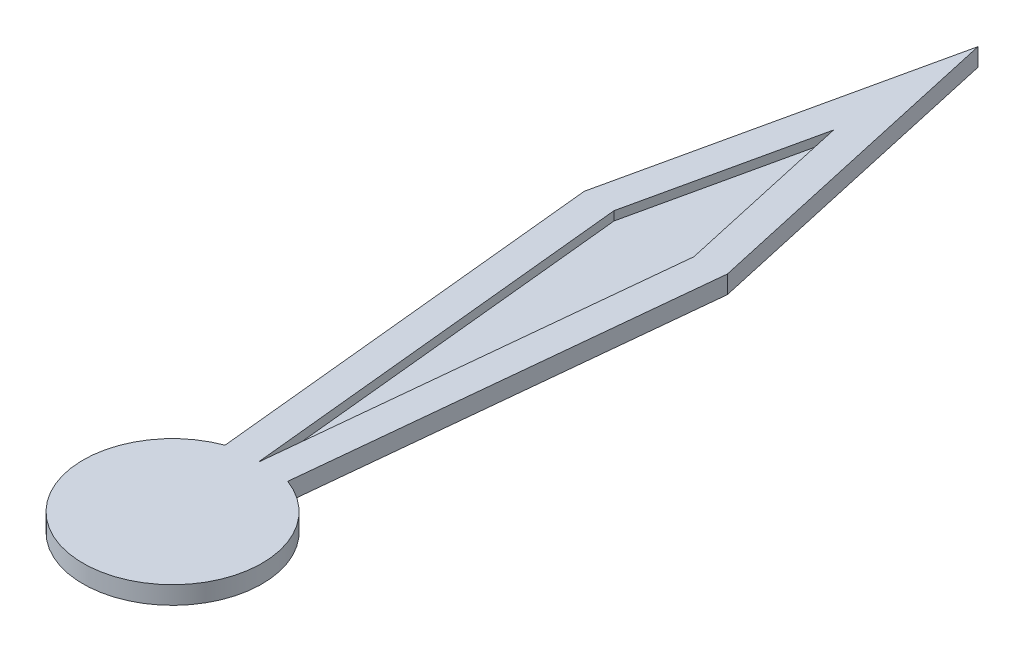
ISO-10303-21;
HEADER;
FILE_DESCRIPTION(('STEP AP214'),'2;1');
FILE_NAME('part.step','',(''),(''),'','','');
FILE_SCHEMA(('AUTOMOTIVE_DESIGN { 1 0 10303 214 1 1 1 1 }'));
ENDSEC;
DATA;
#1=APPLICATION_CONTEXT('core data for automotive mechanical design processes');
#2=APPLICATION_PROTOCOL_DEFINITION('international standard','automotive_design',2000,#1);
#3=PRODUCT_CONTEXT('',#1,'mechanical');
#4=PRODUCT('Part','Part','',(#3));
#5=PRODUCT_RELATED_PRODUCT_CATEGORY('part','',(#4));
#6=PRODUCT_DEFINITION_FORMATION('','',#4);
#7=PRODUCT_DEFINITION_CONTEXT('part definition',#1,'design');
#8=PRODUCT_DEFINITION('design','',#6,#7);
#9=PRODUCT_DEFINITION_SHAPE('','',#8);
#10=(LENGTH_UNIT() NAMED_UNIT(*) SI_UNIT(.MILLI.,.METRE.));
#11=(NAMED_UNIT(*) PLANE_ANGLE_UNIT() SI_UNIT($,.RADIAN.));
#12=(NAMED_UNIT(*) SI_UNIT($,.STERADIAN.) SOLID_ANGLE_UNIT());
#13=UNCERTAINTY_MEASURE_WITH_UNIT(LENGTH_MEASURE(1.E-05),#10,'distance_accuracy_value','');
#14=(GEOMETRIC_REPRESENTATION_CONTEXT(3) GLOBAL_UNCERTAINTY_ASSIGNED_CONTEXT((#13)) GLOBAL_UNIT_ASSIGNED_CONTEXT((#10,
#11,#12)) REPRESENTATION_CONTEXT('',''));
#15=CARTESIAN_POINT('',(0.,0.,0.));
#16=DIRECTION('',(0.,0.,1.));
#17=DIRECTION('',(1.,0.,0.));
#18=AXIS2_PLACEMENT_3D('',#15,#16,#17);
#19=CARTESIAN_POINT('',(0.,0.2,-9.));
#20=DIRECTION('',(0.976187060183953,0.,0.216930457818656));
#21=DIRECTION('',(0.216930457818656,0.,-0.976187060183953));
#22=AXIS2_PLACEMENT_3D('',#19,#20,#21);
#23=PLANE('',#22);
#24=DIRECTION('',(-0.216930457818656,0.,0.976187060183953));
#25=VECTOR('',#24,1.);
#26=CARTESIAN_POINT('',(0.,0.,-9.));
#27=LINE('',#26,#25);
#28=CARTESIAN_POINT('',(0.,0.,-9.));
#29=VERTEX_POINT('',#28);
#30=CARTESIAN_POINT('',(-0.8,0.,-5.4));
#31=VERTEX_POINT('',#30);
#32=EDGE_CURVE('E123',#29,#31,#27,.T.);
#33=ORIENTED_EDGE('',*,*,#32,.T.);
#34=DIRECTION('',(0.,-1.,0.));
#35=VECTOR('',#34,1.);
#36=CARTESIAN_POINT('',(-0.8,0.2,-5.4));
#37=LINE('',#36,#35);
#38=CARTESIAN_POINT('',(-0.8,0.2,-5.4));
#39=VERTEX_POINT('',#38);
#40=EDGE_CURVE('E11',#39,#31,#37,.T.);
#41=ORIENTED_EDGE('',*,*,#40,.F.);
#42=DIRECTION('',(-0.216930457818656,0.,0.976187060183953));
#43=VECTOR('',#42,1.);
#44=CARTESIAN_POINT('',(0.,0.2,-9.));
#45=LINE('',#44,#43);
#46=CARTESIAN_POINT('',(0.,0.2,-9.));
#47=VERTEX_POINT('',#46);
#48=EDGE_CURVE('E134',#47,#39,#45,.T.);
#49=ORIENTED_EDGE('',*,*,#48,.F.);
#50=DIRECTION('',(0.,-1.,0.));
#51=VECTOR('',#50,1.);
#52=CARTESIAN_POINT('',(0.,0.2,-9.));
#53=LINE('',#52,#51);
#54=EDGE_CURVE('E119',#47,#29,#53,.T.);
#55=ORIENTED_EDGE('',*,*,#54,.T.);
#56=EDGE_LOOP('',(#33,#41,#49,#55));
#57=FACE_BOUND('',#56,.T.);
#58=ADVANCED_FACE('F37',(#57),#23,.F.);
#59=CARTESIAN_POINT('',(-0.8,0.2,-5.4));
#60=DIRECTION('',(0.994955747642705,0.,-0.100314805650742));
#61=DIRECTION('',(-0.100314805650742,0.,-0.994955747642705));
#62=AXIS2_PLACEMENT_3D('',#59,#60,#61);
#63=PLANE('',#62);
#64=DIRECTION('',(0.100314805650742,0.,0.994955747642705));
#65=VECTOR('',#64,1.);
#66=CARTESIAN_POINT('',(-0.8,0.,-5.4));
#67=LINE('',#66,#65);
#68=CARTESIAN_POINT('',(-0.35,0.,-0.93674969975976));
#69=VERTEX_POINT('',#68);
#70=EDGE_CURVE('E126',#31,#69,#67,.T.);
#71=ORIENTED_EDGE('',*,*,#70,.T.);
#72=DIRECTION('',(0.,-1.,0.));
#73=VECTOR('',#72,1.);
#74=CARTESIAN_POINT('',(-0.35,0.2,-0.93674969975976));
#75=LINE('',#74,#73);
#76=CARTESIAN_POINT('',(-0.35,0.2,-0.93674969975976));
#77=VERTEX_POINT('',#76);
#78=EDGE_CURVE('E44',#77,#69,#75,.T.);
#79=ORIENTED_EDGE('',*,*,#78,.F.);
#80=DIRECTION('',(0.100314805650742,0.,0.994955747642705));
#81=VECTOR('',#80,1.);
#82=CARTESIAN_POINT('',(-0.8,0.2,-5.4));
#83=LINE('',#82,#81);
#84=EDGE_CURVE('E92',#39,#77,#83,.T.);
#85=ORIENTED_EDGE('',*,*,#84,.F.);
#86=ORIENTED_EDGE('',*,*,#40,.T.);
#87=EDGE_LOOP('',(#71,#79,#85,#86));
#88=FACE_BOUND('',#87,.T.);
#89=ADVANCED_FACE('F237',(#88),#63,.F.);
#90=CARTESIAN_POINT('',(0.,0.2,0.));
#91=DIRECTION('',(0.,-1.,0.));
#92=DIRECTION('',(0.,0.,-1.));
#93=AXIS2_PLACEMENT_3D('',#90,#91,#92);
#94=CYLINDRICAL_SURFACE('',#93,1.);
#95=CARTESIAN_POINT('',(0.,0.,0.));
#96=DIRECTION('',(0.,1.,0.));
#97=DIRECTION('',(0.,0.,1.));
#98=AXIS2_PLACEMENT_3D('',#95,#96,#97);
#99=CIRCLE('',#98,1.);
#100=CARTESIAN_POINT('',(0.35,0.,-0.93674969975976));
#101=VERTEX_POINT('',#100);
#102=EDGE_CURVE('E112',#69,#101,#99,.T.);
#103=ORIENTED_EDGE('',*,*,#102,.T.);
#104=DIRECTION('',(0.,-1.,0.));
#105=VECTOR('',#104,1.);
#106=CARTESIAN_POINT('',(0.35,0.2,-0.93674969975976));
#107=LINE('',#106,#105);
#108=CARTESIAN_POINT('',(0.35,0.2,-0.93674969975976));
#109=VERTEX_POINT('',#108);
#110=EDGE_CURVE('E109',#109,#101,#107,.T.);
#111=ORIENTED_EDGE('',*,*,#110,.F.);
#112=CARTESIAN_POINT('',(0.,0.2,0.));
#113=DIRECTION('',(0.,1.,0.));
#114=DIRECTION('',(0.,0.,1.));
#115=AXIS2_PLACEMENT_3D('',#112,#113,#114);
#116=CIRCLE('',#115,1.);
#117=EDGE_CURVE('E99',#77,#109,#116,.T.);
#118=ORIENTED_EDGE('',*,*,#117,.F.);
#119=ORIENTED_EDGE('',*,*,#78,.T.);
#120=EDGE_LOOP('',(#103,#111,#118,#119));
#121=FACE_BOUND('',#120,.T.);
#122=ADVANCED_FACE('F110',(#121),#94,.T.);
#123=CARTESIAN_POINT('',(0.8,0.2,-5.4));
#124=DIRECTION('',(-0.994955747642705,0.,-0.100314805650742));
#125=DIRECTION('',(-0.100314805650742,0.,0.994955747642705));
#126=AXIS2_PLACEMENT_3D('',#123,#124,#125);
#127=PLANE('',#126);
#128=DIRECTION('',(0.100314805650742,0.,-0.994955747642705));
#129=VECTOR('',#128,1.);
#130=CARTESIAN_POINT('',(0.8,0.,-5.4));
#131=LINE('',#130,#129);
#132=CARTESIAN_POINT('',(0.8,0.,-5.4));
#133=VERTEX_POINT('',#132);
#134=EDGE_CURVE('E131',#101,#133,#131,.T.);
#135=ORIENTED_EDGE('',*,*,#134,.T.);
#136=DIRECTION('',(0.,-1.,0.));
#137=VECTOR('',#136,1.);
#138=CARTESIAN_POINT('',(0.8,0.2,-5.4));
#139=LINE('',#138,#137);
#140=CARTESIAN_POINT('',(0.8,0.2,-5.4));
#141=VERTEX_POINT('',#140);
#142=EDGE_CURVE('E115',#141,#133,#139,.T.);
#143=ORIENTED_EDGE('',*,*,#142,.F.);
#144=DIRECTION('',(0.100314805650742,0.,-0.994955747642705));
#145=VECTOR('',#144,1.);
#146=CARTESIAN_POINT('',(0.8,0.2,-5.4));
#147=LINE('',#146,#145);
#148=EDGE_CURVE('E103',#109,#141,#147,.T.);
#149=ORIENTED_EDGE('',*,*,#148,.F.);
#150=ORIENTED_EDGE('',*,*,#110,.T.);
#151=EDGE_LOOP('',(#135,#143,#149,#150));
#152=FACE_BOUND('',#151,.T.);
#153=ADVANCED_FACE('F117',(#152),#127,.F.);
#154=CARTESIAN_POINT('',(0.,0.2,-9.));
#155=DIRECTION('',(-0.976187060183953,0.,0.216930457818656));
#156=DIRECTION('',(0.216930457818656,0.,0.976187060183953));
#157=AXIS2_PLACEMENT_3D('',#154,#155,#156);
#158=PLANE('',#157);
#159=DIRECTION('',(-0.216930457818656,0.,-0.976187060183953));
#160=VECTOR('',#159,1.);
#161=CARTESIAN_POINT('',(0.,0.,-9.));
#162=LINE('',#161,#160);
#163=EDGE_CURVE('E84',#133,#29,#162,.T.);
#164=ORIENTED_EDGE('',*,*,#163,.T.);
#165=ORIENTED_EDGE('',*,*,#54,.F.);
#166=DIRECTION('',(-0.216930457818656,0.,-0.976187060183953));
#167=VECTOR('',#166,1.);
#168=CARTESIAN_POINT('',(0.,0.2,-9.));
#169=LINE('',#168,#167);
#170=EDGE_CURVE('E60',#141,#47,#169,.T.);
#171=ORIENTED_EDGE('',*,*,#170,.F.);
#172=ORIENTED_EDGE('',*,*,#142,.T.);
#173=EDGE_LOOP('',(#164,#165,#171,#172));
#174=FACE_BOUND('',#173,.T.);
#175=ADVANCED_FACE('F139',(#174),#158,.F.);
#176=CARTESIAN_POINT('',(0.,0.2,0.));
#177=DIRECTION('',(0.,1.,0.));
#178=DIRECTION('',(0.,0.,1.));
#179=AXIS2_PLACEMENT_3D('',#176,#177,#178);
#180=PLANE('',#179);
#181=DIRECTION('',(-0.216930457818656,0.,0.976187060183953));
#182=VECTOR('',#181,1.);
#183=CARTESIAN_POINT('',(0.,0.2,-7.38657971997374));
#184=LINE('',#183,#182);
#185=CARTESIAN_POINT('',(0.,0.2,-7.38657971997374));
#186=VERTEX_POINT('',#185);
#187=CARTESIAN_POINT('',(-0.446114685710567,0.2,-5.37906363427619));
#188=VERTEX_POINT('',#187);
#189=EDGE_CURVE('E51',#186,#188,#184,.T.);
#190=ORIENTED_EDGE('',*,*,#189,.F.);
#191=DIRECTION('',(-0.216930457818656,0.,-0.976187060183953));
#192=VECTOR('',#191,1.);
#193=CARTESIAN_POINT('',(0.446114685710567,0.2,-5.37906363427619));
#194=LINE('',#193,#192);
#195=CARTESIAN_POINT('',(0.446114685710567,0.2,-5.37906363427619));
#196=VERTEX_POINT('',#195);
#197=EDGE_CURVE('E159',#196,#186,#194,.T.);
#198=ORIENTED_EDGE('',*,*,#197,.F.);
#199=DIRECTION('',(0.100314805650742,0.,-0.994955747642705));
#200=VECTOR('',#199,1.);
#201=CARTESIAN_POINT('',(0.00176548832505312,0.2,-0.97185988173752));
#202=LINE('',#201,#200);
#203=CARTESIAN_POINT('',(0.00176548832505312,0.2,-0.97185988173752));
#204=VERTEX_POINT('',#203);
#205=EDGE_CURVE('E163',#204,#196,#202,.T.);
#206=ORIENTED_EDGE('',*,*,#205,.F.);
#207=DIRECTION('',(1.,0.,-3.6846536692431E-13));
#208=VECTOR('',#207,1.);
#209=CARTESIAN_POINT('',(-0.00176548832505323,0.2,-0.971859881737518));
#210=LINE('',#209,#208);
#211=CARTESIAN_POINT('',(-0.00176548832505323,0.2,-0.971859881737518));
#212=VERTEX_POINT('',#211);
#213=EDGE_CURVE('E167',#212,#204,#210,.T.);
#214=ORIENTED_EDGE('',*,*,#213,.F.);
#215=DIRECTION('',(0.100314805650742,0.,0.994955747642705));
#216=VECTOR('',#215,1.);
#217=CARTESIAN_POINT('',(-0.446114685710567,0.2,-5.37906363427619));
#218=LINE('',#217,#216);
#219=EDGE_CURVE('E170',#188,#212,#218,.T.);
#220=ORIENTED_EDGE('',*,*,#219,.F.);
#221=EDGE_LOOP('',(#190,#198,#206,#214,#220));
#222=FACE_BOUND('',#221,.T.);
#223=ORIENTED_EDGE('',*,*,#48,.T.);
#224=ORIENTED_EDGE('',*,*,#84,.T.);
#225=ORIENTED_EDGE('',*,*,#117,.T.);
#226=ORIENTED_EDGE('',*,*,#148,.T.);
#227=ORIENTED_EDGE('',*,*,#170,.T.);
#228=EDGE_LOOP('',(#223,#224,#225,#226,#227));
#229=FACE_BOUND('',#228,.T.);
#230=ADVANCED_FACE('F101',(#222,#229),#180,.T.);
#231=CARTESIAN_POINT('',(0.,0.,0.));
#232=DIRECTION('',(0.,1.,0.));
#233=DIRECTION('',(0.,0.,1.));
#234=AXIS2_PLACEMENT_3D('',#231,#232,#233);
#235=PLANE('',#234);
#236=ORIENTED_EDGE('',*,*,#32,.F.);
#237=ORIENTED_EDGE('',*,*,#163,.F.);
#238=ORIENTED_EDGE('',*,*,#134,.F.);
#239=ORIENTED_EDGE('',*,*,#102,.F.);
#240=ORIENTED_EDGE('',*,*,#70,.F.);
#241=EDGE_LOOP('',(#236,#237,#238,#239,#240));
#242=FACE_BOUND('',#241,.T.);
#243=ADVANCED_FACE('F138',(#242),#235,.F.);
#244=CARTESIAN_POINT('',(0.,0.1,-7.38657971997374));
#245=DIRECTION('',(-0.976187060183953,0.,-0.216930457818656));
#246=DIRECTION('',(-0.216930457818656,0.,0.976187060183953));
#247=AXIS2_PLACEMENT_3D('',#244,#245,#246);
#248=PLANE('',#247);
#249=ORIENTED_EDGE('',*,*,#189,.T.);
#250=DIRECTION('',(0.,1.,0.));
#251=VECTOR('',#250,1.);
#252=CARTESIAN_POINT('',(-0.446114685710567,0.1,-5.37906363427619));
#253=LINE('',#252,#251);
#254=CARTESIAN_POINT('',(-0.446114685710567,0.1,-5.37906363427619));
#255=VERTEX_POINT('',#254);
#256=EDGE_CURVE('E146',#255,#188,#253,.T.);
#257=ORIENTED_EDGE('',*,*,#256,.F.);
#258=DIRECTION('',(-0.216930457818656,0.,0.976187060183953));
#259=VECTOR('',#258,1.);
#260=CARTESIAN_POINT('',(0.,0.1,-7.38657971997374));
#261=LINE('',#260,#259);
#262=CARTESIAN_POINT('',(0.,0.1,-7.38657971997374));
#263=VERTEX_POINT('',#262);
#264=EDGE_CURVE('E162',#263,#255,#261,.T.);
#265=ORIENTED_EDGE('',*,*,#264,.F.);
#266=DIRECTION('',(0.,1.,0.));
#267=VECTOR('',#266,1.);
#268=CARTESIAN_POINT('',(0.,0.1,-7.38657971997374));
#269=LINE('',#268,#267);
#270=EDGE_CURVE('E127',#263,#186,#269,.T.);
#271=ORIENTED_EDGE('',*,*,#270,.T.);
#272=EDGE_LOOP('',(#249,#257,#265,#271));
#273=FACE_BOUND('',#272,.T.);
#274=ADVANCED_FACE('F197',(#273),#248,.F.);
#275=CARTESIAN_POINT('',(0.446114685710567,0.1,-5.37906363427619));
#276=DIRECTION('',(0.976187060183953,0.,-0.216930457818656));
#277=DIRECTION('',(-0.216930457818656,0.,-0.976187060183953));
#278=AXIS2_PLACEMENT_3D('',#275,#276,#277);
#279=PLANE('',#278);
#280=ORIENTED_EDGE('',*,*,#197,.T.);
#281=ORIENTED_EDGE('',*,*,#270,.F.);
#282=DIRECTION('',(-0.216930457818656,0.,-0.976187060183953));
#283=VECTOR('',#282,1.);
#284=CARTESIAN_POINT('',(0.446114685710567,0.1,-5.37906363427619));
#285=LINE('',#284,#283);
#286=CARTESIAN_POINT('',(0.446114685710567,0.1,-5.37906363427619));
#287=VERTEX_POINT('',#286);
#288=EDGE_CURVE('E149',#287,#263,#285,.T.);
#289=ORIENTED_EDGE('',*,*,#288,.F.);
#290=DIRECTION('',(0.,1.,0.));
#291=VECTOR('',#290,1.);
#292=CARTESIAN_POINT('',(0.446114685710567,0.1,-5.37906363427619));
#293=LINE('',#292,#291);
#294=EDGE_CURVE('E155',#287,#196,#293,.T.);
#295=ORIENTED_EDGE('',*,*,#294,.T.);
#296=EDGE_LOOP('',(#280,#281,#289,#295));
#297=FACE_BOUND('',#296,.T.);
#298=ADVANCED_FACE('F211',(#297),#279,.F.);
#299=CARTESIAN_POINT('',(0.00176548832505312,0.1,-0.97185988173752));
#300=DIRECTION('',(0.994955747642705,0.,0.100314805650742));
#301=DIRECTION('',(0.100314805650742,0.,-0.994955747642705));
#302=AXIS2_PLACEMENT_3D('',#299,#300,#301);
#303=PLANE('',#302);
#304=ORIENTED_EDGE('',*,*,#205,.T.);
#305=ORIENTED_EDGE('',*,*,#294,.F.);
#306=DIRECTION('',(0.100314805650742,0.,-0.994955747642705));
#307=VECTOR('',#306,1.);
#308=CARTESIAN_POINT('',(0.00176548832505312,0.1,-0.97185988173752));
#309=LINE('',#308,#307);
#310=CARTESIAN_POINT('',(0.00176548832505312,0.1,-0.97185988173752));
#311=VERTEX_POINT('',#310);
#312=EDGE_CURVE('E177',#311,#287,#309,.T.);
#313=ORIENTED_EDGE('',*,*,#312,.F.);
#314=DIRECTION('',(0.,1.,0.));
#315=VECTOR('',#314,1.);
#316=CARTESIAN_POINT('',(0.00176548832505312,0.1,-0.97185988173752));
#317=LINE('',#316,#315);
#318=EDGE_CURVE('E152',#311,#204,#317,.T.);
#319=ORIENTED_EDGE('',*,*,#318,.T.);
#320=EDGE_LOOP('',(#304,#305,#313,#319));
#321=FACE_BOUND('',#320,.T.);
#322=ADVANCED_FACE('F216',(#321),#303,.F.);
#323=CARTESIAN_POINT('',(-0.00176548832505323,0.1,-0.971859881737518));
#324=DIRECTION('',(3.6846536692431E-13,0.,1.));
#325=DIRECTION('',(1.,0.,-3.6846536692431E-13));
#326=AXIS2_PLACEMENT_3D('',#323,#324,#325);
#327=PLANE('',#326);
#328=ORIENTED_EDGE('',*,*,#213,.T.);
#329=ORIENTED_EDGE('',*,*,#318,.F.);
#330=DIRECTION('',(1.,0.,-3.6846536692431E-13));
#331=VECTOR('',#330,1.);
#332=CARTESIAN_POINT('',(-0.00176548832505323,0.1,-0.971859881737518));
#333=LINE('',#332,#331);
#334=CARTESIAN_POINT('',(-0.00176548832505323,0.1,-0.971859881737518));
#335=VERTEX_POINT('',#334);
#336=EDGE_CURVE('E181',#335,#311,#333,.T.);
#337=ORIENTED_EDGE('',*,*,#336,.F.);
#338=DIRECTION('',(0.,1.,0.));
#339=VECTOR('',#338,1.);
#340=CARTESIAN_POINT('',(-0.00176548832505323,0.1,-0.971859881737518));
#341=LINE('',#340,#339);
#342=EDGE_CURVE('E148',#335,#212,#341,.T.);
#343=ORIENTED_EDGE('',*,*,#342,.T.);
#344=EDGE_LOOP('',(#328,#329,#337,#343));
#345=FACE_BOUND('',#344,.T.);
#346=ADVANCED_FACE('F227',(#345),#327,.F.);
#347=CARTESIAN_POINT('',(-0.446114685710567,0.1,-5.37906363427619));
#348=DIRECTION('',(-0.994955747642705,0.,0.100314805650742));
#349=DIRECTION('',(0.100314805650742,0.,0.994955747642705));
#350=AXIS2_PLACEMENT_3D('',#347,#348,#349);
#351=PLANE('',#350);
#352=ORIENTED_EDGE('',*,*,#219,.T.);
#353=ORIENTED_EDGE('',*,*,#342,.F.);
#354=DIRECTION('',(0.100314805650742,0.,0.994955747642705));
#355=VECTOR('',#354,1.);
#356=CARTESIAN_POINT('',(-0.446114685710567,0.1,-5.37906363427619));
#357=LINE('',#356,#355);
#358=EDGE_CURVE('E184',#255,#335,#357,.T.);
#359=ORIENTED_EDGE('',*,*,#358,.F.);
#360=ORIENTED_EDGE('',*,*,#256,.T.);
#361=EDGE_LOOP('',(#352,#353,#359,#360));
#362=FACE_BOUND('',#361,.T.);
#363=ADVANCED_FACE('F223',(#362),#351,.F.);
#364=CARTESIAN_POINT('',(0.,0.1,0.));
#365=DIRECTION('',(0.,1.,0.));
#366=DIRECTION('',(0.,0.,1.));
#367=AXIS2_PLACEMENT_3D('',#364,#365,#366);
#368=PLANE('',#367);
#369=ORIENTED_EDGE('',*,*,#264,.T.);
#370=ORIENTED_EDGE('',*,*,#358,.T.);
#371=ORIENTED_EDGE('',*,*,#336,.T.);
#372=ORIENTED_EDGE('',*,*,#312,.T.);
#373=ORIENTED_EDGE('',*,*,#288,.T.);
#374=EDGE_LOOP('',(#369,#370,#371,#372,#373));
#375=FACE_BOUND('',#374,.T.);
#376=ADVANCED_FACE('F192',(#375),#368,.T.);
#377=CLOSED_SHELL('',(#58,#89,#122,#153,#175,#230,#243,#274,#298,#322,#346,#363,#376));
#378=MANIFOLD_SOLID_BREP('B2',#377);
#379=ADVANCED_BREP_SHAPE_REPRESENTATION('',(#18,#378),#14);
#380=SHAPE_DEFINITION_REPRESENTATION(#9,#379);
ENDSEC;
END-ISO-10303-21;
